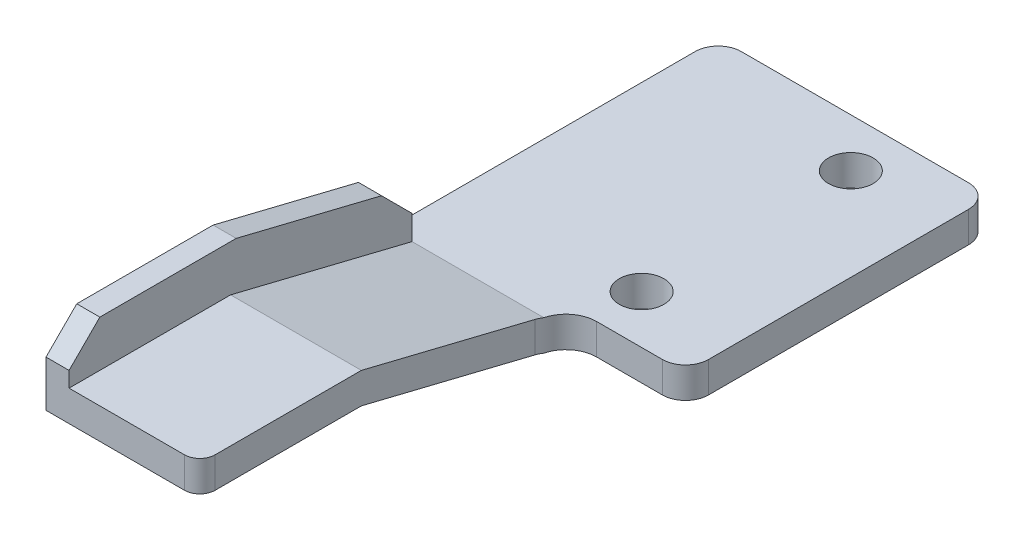
ISO-10303-21;
HEADER;
FILE_DESCRIPTION(('STEP AP214'),'2;1');
FILE_NAME('part.step','',(''),(''),'','','');
FILE_SCHEMA(('AUTOMOTIVE_DESIGN { 1 0 10303 214 1 1 1 1 }'));
ENDSEC;
DATA;
#1=APPLICATION_CONTEXT('core data for automotive mechanical design processes');
#2=APPLICATION_PROTOCOL_DEFINITION('international standard','automotive_design',2000,#1);
#3=PRODUCT_CONTEXT('',#1,'mechanical');
#4=PRODUCT('Part','Part','',(#3));
#5=PRODUCT_RELATED_PRODUCT_CATEGORY('part','',(#4));
#6=PRODUCT_DEFINITION_FORMATION('','',#4);
#7=PRODUCT_DEFINITION_CONTEXT('part definition',#1,'design');
#8=PRODUCT_DEFINITION('design','',#6,#7);
#9=PRODUCT_DEFINITION_SHAPE('','',#8);
#10=(LENGTH_UNIT() NAMED_UNIT(*) SI_UNIT(.MILLI.,.METRE.));
#11=(NAMED_UNIT(*) PLANE_ANGLE_UNIT() SI_UNIT($,.RADIAN.));
#12=(NAMED_UNIT(*) SI_UNIT($,.STERADIAN.) SOLID_ANGLE_UNIT());
#13=UNCERTAINTY_MEASURE_WITH_UNIT(LENGTH_MEASURE(1.E-05),#10,'distance_accuracy_value','');
#14=(GEOMETRIC_REPRESENTATION_CONTEXT(3) GLOBAL_UNCERTAINTY_ASSIGNED_CONTEXT((#13)) GLOBAL_UNIT_ASSIGNED_CONTEXT((#10,
#11,#12)) REPRESENTATION_CONTEXT('',''));
#15=CARTESIAN_POINT('',(0.,0.,0.));
#16=DIRECTION('',(0.,0.,1.));
#17=DIRECTION('',(1.,0.,0.));
#18=AXIS2_PLACEMENT_3D('',#15,#16,#17);
#19=CARTESIAN_POINT('',(1.115,2.,11.45));
#20=DIRECTION('',(0.,0.971102968422699,-0.238660899019138));
#21=DIRECTION('',(0.,0.238660899019138,0.971102968422699));
#22=AXIS2_PLACEMENT_3D('',#19,#20,#21);
#23=PLANE('',#22);
#24=DIRECTION('',(-1.,0.,0.));
#25=VECTOR('',#24,1.);
#26=CARTESIAN_POINT('',(1.115,2.,11.45));
#27=LINE('',#26,#25);
#28=CARTESIAN_POINT('',(1.17850832689629,2.,11.45));
#29=VERTEX_POINT('',#28);
#30=CARTESIAN_POINT('',(-7.385,2.,11.45));
#31=VERTEX_POINT('',#30);
#32=EDGE_CURVE('E66',#29,#31,#27,.T.);
#33=ORIENTED_EDGE('',*,*,#32,.T.);
#34=DIRECTION('',(0.,0.238660899019138,0.971102968422699));
#35=VECTOR('',#34,1.);
#36=CARTESIAN_POINT('',(-7.38499999999999,4.9,23.25));
#37=LINE('',#36,#35);
#38=CARTESIAN_POINT('',(-7.38499999999999,4.9,23.25));
#39=VERTEX_POINT('',#38);
#40=EDGE_CURVE('E229',#31,#39,#37,.T.);
#41=ORIENTED_EDGE('',*,*,#40,.T.);
#42=DIRECTION('',(-1.,0.,0.));
#43=VECTOR('',#42,1.);
#44=CARTESIAN_POINT('',(1.115,4.9,23.25));
#45=LINE('',#44,#43);
#46=CARTESIAN_POINT('',(1.115,4.9,23.25));
#47=VERTEX_POINT('',#46);
#48=EDGE_CURVE('E279',#47,#39,#45,.T.);
#49=ORIENTED_EDGE('',*,*,#48,.F.);
#50=DIRECTION('',(0.,-0.238660899019138,-0.971102968422699));
#51=VECTOR('',#50,1.);
#52=CARTESIAN_POINT('',(1.115,2.,11.45));
#53=LINE('',#52,#51);
#54=CARTESIAN_POINT('',(1.115,2.1228813559322,11.95));
#55=VERTEX_POINT('',#54);
#56=EDGE_CURVE('E263',#47,#55,#53,.T.);
#57=ORIENTED_EDGE('',*,*,#56,.T.);
#58=CARTESIAN_POINT('',(3.115,2.1228813559322,11.95));
#59=DIRECTION('',(0.,0.971102968422699,-0.238660899019138));
#60=DIRECTION('',(0.,0.238660899019138,0.971102968422699));
#61=AXIS2_PLACEMENT_3D('',#58,#59,#60);
#62=ELLIPSE('',#61,2.05951383636328,2.);
#63=EDGE_CURVE('E60',#55,#29,#62,.F.);
#64=ORIENTED_EDGE('',*,*,#63,.T.);
#65=EDGE_LOOP('',(#33,#41,#49,#57,#64));
#66=FACE_BOUND('',#65,.T.);
#67=ADVANCED_FACE('F51',(#66),#23,.T.);
#68=CARTESIAN_POINT('',(1.115,4.9,23.25));
#69=DIRECTION('',(0.,1.,0.));
#70=DIRECTION('',(0.,0.,1.));
#71=AXIS2_PLACEMENT_3D('',#68,#69,#70);
#72=PLANE('',#71);
#73=DIRECTION('',(-1.,0.,0.));
#74=VECTOR('',#73,1.);
#75=CARTESIAN_POINT('',(1.115,4.9,33.75));
#76=LINE('',#75,#74);
#77=CARTESIAN_POINT('',(0.115000000000002,4.9,33.75));
#78=VERTEX_POINT('',#77);
#79=CARTESIAN_POINT('',(-7.38499999999999,4.9,33.75));
#80=VERTEX_POINT('',#79);
#81=EDGE_CURVE('E283',#78,#80,#76,.T.);
#82=ORIENTED_EDGE('',*,*,#81,.F.);
#83=CARTESIAN_POINT('',(0.115000000000001,4.9,32.75));
#84=DIRECTION('',(0.,1.,0.));
#85=DIRECTION('',(0.,0.,1.));
#86=AXIS2_PLACEMENT_3D('',#83,#84,#85);
#87=CIRCLE('',#86,1.);
#88=CARTESIAN_POINT('',(1.115,4.9,32.75));
#89=VERTEX_POINT('',#88);
#90=EDGE_CURVE('E404',#78,#89,#87,.T.);
#91=ORIENTED_EDGE('',*,*,#90,.T.);
#92=DIRECTION('',(0.,0.,-1.));
#93=VECTOR('',#92,1.);
#94=CARTESIAN_POINT('',(1.115,4.9,23.25));
#95=LINE('',#94,#93);
#96=EDGE_CURVE('E260',#89,#47,#95,.T.);
#97=ORIENTED_EDGE('',*,*,#96,.T.);
#98=ORIENTED_EDGE('',*,*,#48,.T.);
#99=DIRECTION('',(0.,0.,1.));
#100=VECTOR('',#99,1.);
#101=CARTESIAN_POINT('',(-7.38499999999999,4.9,33.75));
#102=LINE('',#101,#100);
#103=EDGE_CURVE('E217',#39,#80,#102,.T.);
#104=ORIENTED_EDGE('',*,*,#103,.T.);
#105=EDGE_LOOP('',(#82,#91,#97,#98,#104));
#106=FACE_BOUND('',#105,.T.);
#107=ADVANCED_FACE('F475',(#106),#72,.T.);
#108=CARTESIAN_POINT('',(0.,2.,0.));
#109=DIRECTION('',(0.,-1.,0.));
#110=DIRECTION('',(0.,0.,-1.));
#111=AXIS2_PLACEMENT_3D('',#108,#109,#110);
#112=PLANE('',#111);
#113=ORIENTED_EDGE('',*,*,#32,.F.);
#114=CARTESIAN_POINT('',(3.115,2.,11.95));
#115=DIRECTION('',(0.,-1.,0.));
#116=DIRECTION('',(0.,0.,-1.));
#117=AXIS2_PLACEMENT_3D('',#114,#115,#116);
#118=CIRCLE('',#117,2.);
#119=CARTESIAN_POINT('',(3.115,2.,9.95));
#120=VERTEX_POINT('',#119);
#121=EDGE_CURVE('E11',#29,#120,#118,.T.);
#122=ORIENTED_EDGE('',*,*,#121,.T.);
#123=DIRECTION('',(1.,0.,0.));
#124=VECTOR('',#123,1.);
#125=CARTESIAN_POINT('',(8.885,2.,9.95));
#126=LINE('',#125,#124);
#127=CARTESIAN_POINT('',(7.385,2.,9.95));
#128=VERTEX_POINT('',#127);
#129=EDGE_CURVE('E312',#120,#128,#126,.T.);
#130=ORIENTED_EDGE('',*,*,#129,.T.);
#131=CARTESIAN_POINT('',(7.385,2.,8.45));
#132=DIRECTION('',(0.,-1.,0.));
#133=DIRECTION('',(0.,0.,-1.));
#134=AXIS2_PLACEMENT_3D('',#131,#132,#133);
#135=CIRCLE('',#134,1.5);
#136=CARTESIAN_POINT('',(8.885,2.,8.44999999999999));
#137=VERTEX_POINT('',#136);
#138=EDGE_CURVE('E386',#128,#137,#135,.F.);
#139=ORIENTED_EDGE('',*,*,#138,.T.);
#140=DIRECTION('',(0.,0.,-1.));
#141=VECTOR('',#140,1.);
#142=CARTESIAN_POINT('',(8.885,2.,-9.95));
#143=LINE('',#142,#141);
#144=CARTESIAN_POINT('',(8.885,2.,-8.45));
#145=VERTEX_POINT('',#144);
#146=EDGE_CURVE('E316',#137,#145,#143,.T.);
#147=ORIENTED_EDGE('',*,*,#146,.T.);
#148=CARTESIAN_POINT('',(7.385,2.,-8.45));
#149=DIRECTION('',(0.,-1.,0.));
#150=DIRECTION('',(0.,0.,-1.));
#151=AXIS2_PLACEMENT_3D('',#148,#149,#150);
#152=CIRCLE('',#151,1.5);
#153=CARTESIAN_POINT('',(7.385,2.,-9.95));
#154=VERTEX_POINT('',#153);
#155=EDGE_CURVE('E383',#145,#154,#152,.F.);
#156=ORIENTED_EDGE('',*,*,#155,.T.);
#157=DIRECTION('',(-1.,0.,0.));
#158=VECTOR('',#157,1.);
#159=CARTESIAN_POINT('',(8.885,2.,-9.95));
#160=LINE('',#159,#158);
#161=CARTESIAN_POINT('',(-7.385,2.,-9.95));
#162=VERTEX_POINT('',#161);
#163=EDGE_CURVE('E320',#154,#162,#160,.T.);
#164=ORIENTED_EDGE('',*,*,#163,.T.);
#165=CARTESIAN_POINT('',(-7.385,2.,-8.45));
#166=DIRECTION('',(0.,-1.,0.));
#167=DIRECTION('',(0.,0.,-1.));
#168=AXIS2_PLACEMENT_3D('',#165,#166,#167);
#169=CIRCLE('',#168,1.5);
#170=CARTESIAN_POINT('',(-8.885,2.,-8.45));
#171=VERTEX_POINT('',#170);
#172=EDGE_CURVE('E380',#162,#171,#169,.F.);
#173=ORIENTED_EDGE('',*,*,#172,.T.);
#174=DIRECTION('',(0.,0.,1.));
#175=VECTOR('',#174,1.);
#176=CARTESIAN_POINT('',(-8.885,2.,-9.95));
#177=LINE('',#176,#175);
#178=CARTESIAN_POINT('',(-8.885,2.,11.45));
#179=VERTEX_POINT('',#178);
#180=EDGE_CURVE('E309',#171,#179,#177,.T.);
#181=ORIENTED_EDGE('',*,*,#180,.T.);
#182=DIRECTION('',(-1.,0.,0.));
#183=VECTOR('',#182,1.);
#184=CARTESIAN_POINT('',(-7.385,2.,11.45));
#185=LINE('',#184,#183);
#186=EDGE_CURVE('E216',#31,#179,#185,.T.);
#187=ORIENTED_EDGE('',*,*,#186,.F.);
#188=EDGE_LOOP('',(#113,#122,#130,#139,#147,#156,#164,#173,#181,#187));
#189=FACE_BOUND('',#188,.T.);
#190=CARTESIAN_POINT('',(2.885,2.,-6.8));
#191=DIRECTION('',(0.,1.,0.));
#192=DIRECTION('',(0.,0.,1.));
#193=AXIS2_PLACEMENT_3D('',#190,#191,#192);
#194=CIRCLE('',#193,1.45);
#195=CARTESIAN_POINT('',(2.885,2.,-5.35));
#196=VERTEX_POINT('',#195);
#197=EDGE_CURVE('E302',#196,#196,#194,.T.);
#198=ORIENTED_EDGE('',*,*,#197,.F.);
#199=EDGE_LOOP('',(#198));
#200=FACE_BOUND('',#199,.T.);
#201=CARTESIAN_POINT('',(2.885,2.,6.8));
#202=DIRECTION('',(0.,1.,0.));
#203=DIRECTION('',(0.,0.,1.));
#204=AXIS2_PLACEMENT_3D('',#201,#202,#203);
#205=CIRCLE('',#204,1.45);
#206=CARTESIAN_POINT('',(2.885,2.,8.25));
#207=VERTEX_POINT('',#206);
#208=EDGE_CURVE('E294',#207,#207,#205,.T.);
#209=ORIENTED_EDGE('',*,*,#208,.F.);
#210=EDGE_LOOP('',(#209));
#211=FACE_BOUND('',#210,.T.);
#212=ADVANCED_FACE('F435',(#189,#200,#211),#112,.F.);
#213=CARTESIAN_POINT('',(0.,0.,0.));
#214=DIRECTION('',(0.,-1.,0.));
#215=DIRECTION('',(0.,0.,-1.));
#216=AXIS2_PLACEMENT_3D('',#213,#214,#215);
#217=PLANE('',#216);
#218=CARTESIAN_POINT('',(2.885,0.,-6.8));
#219=DIRECTION('',(0.,1.,0.));
#220=DIRECTION('',(0.,0.,1.));
#221=AXIS2_PLACEMENT_3D('',#218,#219,#220);
#222=CIRCLE('',#221,1.45);
#223=CARTESIAN_POINT('',(2.885,0.,-5.35));
#224=VERTEX_POINT('',#223);
#225=EDGE_CURVE('E298',#224,#224,#222,.T.);
#226=ORIENTED_EDGE('',*,*,#225,.T.);
#227=EDGE_LOOP('',(#226));
#228=FACE_BOUND('',#227,.T.);
#229=DIRECTION('',(0.,0.,-1.));
#230=VECTOR('',#229,1.);
#231=CARTESIAN_POINT('',(8.885,0.,-9.95));
#232=LINE('',#231,#230);
#233=CARTESIAN_POINT('',(8.885,0.,8.44999999999999));
#234=VERTEX_POINT('',#233);
#235=CARTESIAN_POINT('',(8.885,0.,-8.45));
#236=VERTEX_POINT('',#235);
#237=EDGE_CURVE('E330',#234,#236,#232,.T.);
#238=ORIENTED_EDGE('',*,*,#237,.F.);
#239=CARTESIAN_POINT('',(7.385,0.,8.45));
#240=DIRECTION('',(0.,-1.,0.));
#241=DIRECTION('',(0.,0.,-1.));
#242=AXIS2_PLACEMENT_3D('',#239,#240,#241);
#243=CIRCLE('',#242,1.5);
#244=CARTESIAN_POINT('',(7.385,0.,9.95));
#245=VERTEX_POINT('',#244);
#246=EDGE_CURVE('E372',#234,#245,#243,.T.);
#247=ORIENTED_EDGE('',*,*,#246,.T.);
#248=DIRECTION('',(1.,0.,0.));
#249=VECTOR('',#248,1.);
#250=CARTESIAN_POINT('',(8.885,0.,9.95));
#251=LINE('',#250,#249);
#252=CARTESIAN_POINT('',(3.115,0.,9.95));
#253=VERTEX_POINT('',#252);
#254=EDGE_CURVE('E327',#253,#245,#251,.T.);
#255=ORIENTED_EDGE('',*,*,#254,.F.);
#256=CARTESIAN_POINT('',(3.115,0.,11.95));
#257=DIRECTION('',(0.,-1.,0.));
#258=DIRECTION('',(0.,0.,-1.));
#259=AXIS2_PLACEMENT_3D('',#256,#257,#258);
#260=CIRCLE('',#259,2.);
#261=CARTESIAN_POINT('',(1.17850832689629,0.,11.45));
#262=VERTEX_POINT('',#261);
#263=EDGE_CURVE('E420',#253,#262,#260,.F.);
#264=ORIENTED_EDGE('',*,*,#263,.T.);
#265=DIRECTION('',(-1.,0.,0.));
#266=VECTOR('',#265,1.);
#267=CARTESIAN_POINT('',(1.115,0.,11.45));
#268=LINE('',#267,#266);
#269=CARTESIAN_POINT('',(-8.885,0.,11.45));
#270=VERTEX_POINT('',#269);
#271=EDGE_CURVE('E74',#262,#270,#268,.T.);
#272=ORIENTED_EDGE('',*,*,#271,.T.);
#273=DIRECTION('',(0.,0.,1.));
#274=VECTOR('',#273,1.);
#275=CARTESIAN_POINT('',(-8.885,0.,-9.95));
#276=LINE('',#275,#274);
#277=CARTESIAN_POINT('',(-8.885,0.,-8.45));
#278=VERTEX_POINT('',#277);
#279=EDGE_CURVE('E305',#278,#270,#276,.T.);
#280=ORIENTED_EDGE('',*,*,#279,.F.);
#281=CARTESIAN_POINT('',(-7.385,0.,-8.45));
#282=DIRECTION('',(0.,-1.,0.));
#283=DIRECTION('',(0.,0.,-1.));
#284=AXIS2_PLACEMENT_3D('',#281,#282,#283);
#285=CIRCLE('',#284,1.5);
#286=CARTESIAN_POINT('',(-7.385,0.,-9.95));
#287=VERTEX_POINT('',#286);
#288=EDGE_CURVE('E366',#278,#287,#285,.T.);
#289=ORIENTED_EDGE('',*,*,#288,.T.);
#290=DIRECTION('',(-1.,0.,0.));
#291=VECTOR('',#290,1.);
#292=CARTESIAN_POINT('',(8.885,0.,-9.95));
#293=LINE('',#292,#291);
#294=CARTESIAN_POINT('',(7.385,0.,-9.95));
#295=VERTEX_POINT('',#294);
#296=EDGE_CURVE('E313',#295,#287,#293,.T.);
#297=ORIENTED_EDGE('',*,*,#296,.F.);
#298=CARTESIAN_POINT('',(7.385,0.,-8.45));
#299=DIRECTION('',(0.,-1.,0.));
#300=DIRECTION('',(0.,0.,-1.));
#301=AXIS2_PLACEMENT_3D('',#298,#299,#300);
#302=CIRCLE('',#301,1.5);
#303=EDGE_CURVE('E369',#295,#236,#302,.T.);
#304=ORIENTED_EDGE('',*,*,#303,.T.);
#305=EDGE_LOOP('',(#238,#247,#255,#264,#272,#280,#289,#297,#304));
#306=FACE_BOUND('',#305,.T.);
#307=CARTESIAN_POINT('',(2.885,0.,6.8));
#308=DIRECTION('',(0.,1.,0.));
#309=DIRECTION('',(0.,0.,1.));
#310=AXIS2_PLACEMENT_3D('',#307,#308,#309);
#311=CIRCLE('',#310,1.45);
#312=CARTESIAN_POINT('',(2.885,0.,8.25));
#313=VERTEX_POINT('',#312);
#314=EDGE_CURVE('E278',#313,#313,#311,.T.);
#315=ORIENTED_EDGE('',*,*,#314,.T.);
#316=EDGE_LOOP('',(#315));
#317=FACE_BOUND('',#316,.T.);
#318=ADVANCED_FACE('F527',(#228,#306,#317),#217,.T.);
#319=CARTESIAN_POINT('',(-8.885,2.,-9.95));
#320=DIRECTION('',(1.,0.,0.));
#321=DIRECTION('',(0.,0.,-1.));
#322=AXIS2_PLACEMENT_3D('',#319,#320,#321);
#323=PLANE('',#322);
#324=ORIENTED_EDGE('',*,*,#180,.F.);
#325=DIRECTION('',(0.,-1.,0.));
#326=VECTOR('',#325,1.);
#327=CARTESIAN_POINT('',(-8.885,2.,-8.45));
#328=LINE('',#327,#326);
#329=EDGE_CURVE('E396',#171,#278,#328,.T.);
#330=ORIENTED_EDGE('',*,*,#329,.T.);
#331=ORIENTED_EDGE('',*,*,#279,.T.);
#332=DIRECTION('',(0.,0.238660899019138,0.971102968422699));
#333=VECTOR('',#332,1.);
#334=CARTESIAN_POINT('',(-8.885,0.,11.45));
#335=LINE('',#334,#333);
#336=CARTESIAN_POINT('',(-8.885,2.9,23.25));
#337=VERTEX_POINT('',#336);
#338=EDGE_CURVE('E250',#270,#337,#335,.T.);
#339=ORIENTED_EDGE('',*,*,#338,.T.);
#340=DIRECTION('',(0.,0.,1.));
#341=VECTOR('',#340,1.);
#342=CARTESIAN_POINT('',(-8.885,2.9,23.25));
#343=LINE('',#342,#341);
#344=CARTESIAN_POINT('',(-8.88499999999999,2.9,33.75));
#345=VERTEX_POINT('',#344);
#346=EDGE_CURVE('E270',#337,#345,#343,.T.);
#347=ORIENTED_EDGE('',*,*,#346,.T.);
#348=DIRECTION('',(0.,1.,0.));
#349=VECTOR('',#348,1.);
#350=CARTESIAN_POINT('',(-8.88499999999999,2.9,33.75));
#351=LINE('',#350,#349);
#352=CARTESIAN_POINT('',(-8.88499999999999,5.89999999999999,33.75));
#353=VERTEX_POINT('',#352);
#354=EDGE_CURVE('E256',#345,#353,#351,.T.);
#355=ORIENTED_EDGE('',*,*,#354,.T.);
#356=DIRECTION('',(0.,-0.707106781186546,0.707106781186549));
#357=VECTOR('',#356,1.);
#358=CARTESIAN_POINT('',(-8.885,5.89999999999999,33.75));
#359=LINE('',#358,#357);
#360=CARTESIAN_POINT('',(-8.88499999999999,7.9,31.75));
#361=VERTEX_POINT('',#360);
#362=EDGE_CURVE('E340',#353,#361,#359,.F.);
#363=ORIENTED_EDGE('',*,*,#362,.T.);
#364=DIRECTION('',(0.,0.,-1.));
#365=VECTOR('',#364,1.);
#366=CARTESIAN_POINT('',(-8.88499999999999,7.9,33.75));
#367=LINE('',#366,#365);
#368=CARTESIAN_POINT('',(-8.88499999999999,7.9,22.8867603780586));
#369=VERTEX_POINT('',#368);
#370=EDGE_CURVE('E239',#361,#369,#367,.T.);
#371=ORIENTED_EDGE('',*,*,#370,.T.);
#372=DIRECTION('',(0.,-0.238660899019138,-0.971102968422699));
#373=VECTOR('',#372,1.);
#374=CARTESIAN_POINT('',(-8.88499999999999,7.9,22.8867603780586));
#375=LINE('',#374,#373);
#376=CARTESIAN_POINT('',(-8.885,5.57803479948874,13.4387640449438));
#377=VERTEX_POINT('',#376);
#378=EDGE_CURVE('E214',#369,#377,#375,.T.);
#379=ORIENTED_EDGE('',*,*,#378,.T.);
#380=DIRECTION('',(0.,0.707106781186547,0.707106781186548));
#381=VECTOR('',#380,1.);
#382=CARTESIAN_POINT('',(-8.885,5.57803479948874,13.4387640449438));
#383=LINE('',#382,#381);
#384=CARTESIAN_POINT('',(-8.885,3.58927075454492,11.45));
#385=VERTEX_POINT('',#384);
#386=EDGE_CURVE('E351',#377,#385,#383,.F.);
#387=ORIENTED_EDGE('',*,*,#386,.T.);
#388=DIRECTION('',(0.,-1.,0.));
#389=VECTOR('',#388,1.);
#390=CARTESIAN_POINT('',(-8.885,5.08927075454492,11.45));
#391=LINE('',#390,#389);
#392=EDGE_CURVE('E244',#385,#179,#391,.T.);
#393=ORIENTED_EDGE('',*,*,#392,.T.);
#394=EDGE_LOOP('',(#324,#330,#331,#339,#347,#355,#363,#371,#379,#387,#393));
#395=FACE_BOUND('',#394,.T.);
#396=ADVANCED_FACE('F465',(#395),#323,.F.);
#397=CARTESIAN_POINT('',(8.885,2.,9.95));
#398=DIRECTION('',(0.,0.,-1.));
#399=DIRECTION('',(-1.,0.,0.));
#400=AXIS2_PLACEMENT_3D('',#397,#398,#399);
#401=PLANE('',#400);
#402=ORIENTED_EDGE('',*,*,#129,.F.);
#403=DIRECTION('',(0.,-1.,0.));
#404=VECTOR('',#403,1.);
#405=CARTESIAN_POINT('',(3.115,0.,9.95));
#406=LINE('',#405,#404);
#407=EDGE_CURVE('E413',#120,#253,#406,.T.);
#408=ORIENTED_EDGE('',*,*,#407,.T.);
#409=ORIENTED_EDGE('',*,*,#254,.T.);
#410=DIRECTION('',(0.,-1.,0.));
#411=VECTOR('',#410,1.);
#412=CARTESIAN_POINT('',(7.385,2.,9.95));
#413=LINE('',#412,#411);
#414=EDGE_CURVE('E376',#245,#128,#413,.F.);
#415=ORIENTED_EDGE('',*,*,#414,.T.);
#416=EDGE_LOOP('',(#402,#408,#409,#415));
#417=FACE_BOUND('',#416,.T.);
#418=ADVANCED_FACE('F438',(#417),#401,.F.);
#419=CARTESIAN_POINT('',(8.885,2.,-9.95));
#420=DIRECTION('',(-1.,0.,0.));
#421=DIRECTION('',(0.,0.,1.));
#422=AXIS2_PLACEMENT_3D('',#419,#420,#421);
#423=PLANE('',#422);
#424=ORIENTED_EDGE('',*,*,#146,.F.);
#425=DIRECTION('',(0.,-1.,0.));
#426=VECTOR('',#425,1.);
#427=CARTESIAN_POINT('',(8.885,2.,8.45));
#428=LINE('',#427,#426);
#429=EDGE_CURVE('E362',#137,#234,#428,.T.);
#430=ORIENTED_EDGE('',*,*,#429,.T.);
#431=ORIENTED_EDGE('',*,*,#237,.T.);
#432=DIRECTION('',(0.,-1.,0.));
#433=VECTOR('',#432,1.);
#434=CARTESIAN_POINT('',(8.885,2.,-8.45));
#435=LINE('',#434,#433);
#436=EDGE_CURVE('E359',#236,#145,#435,.F.);
#437=ORIENTED_EDGE('',*,*,#436,.T.);
#438=EDGE_LOOP('',(#424,#430,#431,#437));
#439=FACE_BOUND('',#438,.T.);
#440=ADVANCED_FACE('F448',(#439),#423,.F.);
#441=CARTESIAN_POINT('',(8.885,2.,-9.95));
#442=DIRECTION('',(0.,0.,1.));
#443=DIRECTION('',(1.,0.,0.));
#444=AXIS2_PLACEMENT_3D('',#441,#442,#443);
#445=PLANE('',#444);
#446=ORIENTED_EDGE('',*,*,#163,.F.);
#447=DIRECTION('',(0.,-1.,0.));
#448=VECTOR('',#447,1.);
#449=CARTESIAN_POINT('',(7.385,2.,-9.95));
#450=LINE('',#449,#448);
#451=EDGE_CURVE('E392',#154,#295,#450,.T.);
#452=ORIENTED_EDGE('',*,*,#451,.T.);
#453=ORIENTED_EDGE('',*,*,#296,.T.);
#454=DIRECTION('',(0.,-1.,0.));
#455=VECTOR('',#454,1.);
#456=CARTESIAN_POINT('',(-7.385,2.,-9.95));
#457=LINE('',#456,#455);
#458=EDGE_CURVE('E389',#287,#162,#457,.F.);
#459=ORIENTED_EDGE('',*,*,#458,.T.);
#460=EDGE_LOOP('',(#446,#452,#453,#459));
#461=FACE_BOUND('',#460,.T.);
#462=ADVANCED_FACE('F457',(#461),#445,.F.);
#463=CARTESIAN_POINT('',(2.885,2.,-6.8));
#464=DIRECTION('',(0.,-1.,0.));
#465=DIRECTION('',(0.,0.,-1.));
#466=AXIS2_PLACEMENT_3D('',#463,#464,#465);
#467=CYLINDRICAL_SURFACE('',#466,1.45);
#468=ORIENTED_EDGE('',*,*,#197,.T.);
#469=EDGE_LOOP('',(#468));
#470=FACE_BOUND('',#469,.T.);
#471=ORIENTED_EDGE('',*,*,#225,.F.);
#472=EDGE_LOOP('',(#471));
#473=FACE_BOUND('',#472,.T.);
#474=ADVANCED_FACE('F517',(#470,#473),#467,.F.);
#475=CARTESIAN_POINT('',(2.885,2.,6.8));
#476=DIRECTION('',(0.,-1.,0.));
#477=DIRECTION('',(0.,0.,-1.));
#478=AXIS2_PLACEMENT_3D('',#475,#476,#477);
#479=CYLINDRICAL_SURFACE('',#478,1.45);
#480=ORIENTED_EDGE('',*,*,#208,.T.);
#481=EDGE_LOOP('',(#480));
#482=FACE_BOUND('',#481,.T.);
#483=ORIENTED_EDGE('',*,*,#314,.F.);
#484=EDGE_LOOP('',(#483));
#485=FACE_BOUND('',#484,.T.);
#486=ADVANCED_FACE('F514',(#482,#485),#479,.F.);
#487=CARTESIAN_POINT('',(1.115,2.9,33.75));
#488=DIRECTION('',(0.,0.,1.));
#489=DIRECTION('',(1.,0.,0.));
#490=AXIS2_PLACEMENT_3D('',#487,#488,#489);
#491=PLANE('',#490);
#492=DIRECTION('',(-1.,0.,0.));
#493=VECTOR('',#492,1.);
#494=CARTESIAN_POINT('',(1.115,2.9,33.75));
#495=LINE('',#494,#493);
#496=CARTESIAN_POINT('',(0.115000000000002,2.9,33.75));
#497=VERTEX_POINT('',#496);
#498=EDGE_CURVE('E286',#497,#345,#495,.T.);
#499=ORIENTED_EDGE('',*,*,#498,.F.);
#500=DIRECTION('',(0.,1.,0.));
#501=VECTOR('',#500,1.);
#502=CARTESIAN_POINT('',(0.115000000000002,4.9,33.75));
#503=LINE('',#502,#501);
#504=EDGE_CURVE('E400',#497,#78,#503,.T.);
#505=ORIENTED_EDGE('',*,*,#504,.T.);
#506=ORIENTED_EDGE('',*,*,#81,.T.);
#507=DIRECTION('',(0.,1.,0.));
#508=VECTOR('',#507,1.);
#509=CARTESIAN_POINT('',(-7.38499999999999,4.9,33.75));
#510=LINE('',#509,#508);
#511=CARTESIAN_POINT('',(-7.38499999999999,5.89999999999999,33.75));
#512=VERTEX_POINT('',#511);
#513=EDGE_CURVE('E206',#80,#512,#510,.T.);
#514=ORIENTED_EDGE('',*,*,#513,.T.);
#515=DIRECTION('',(-1.,0.,0.));
#516=VECTOR('',#515,1.);
#517=CARTESIAN_POINT('',(1.115,5.89999999999999,33.75));
#518=LINE('',#517,#516);
#519=EDGE_CURVE('E324',#512,#353,#518,.T.);
#520=ORIENTED_EDGE('',*,*,#519,.T.);
#521=ORIENTED_EDGE('',*,*,#354,.F.);
#522=EDGE_LOOP('',(#499,#505,#506,#514,#520,#521));
#523=FACE_BOUND('',#522,.T.);
#524=ADVANCED_FACE('F493',(#523),#491,.T.);
#525=CARTESIAN_POINT('',(1.115,2.9,23.25));
#526=DIRECTION('',(0.,-1.,0.));
#527=DIRECTION('',(0.,0.,-1.));
#528=AXIS2_PLACEMENT_3D('',#525,#526,#527);
#529=PLANE('',#528);
#530=DIRECTION('',(0.,0.,1.));
#531=VECTOR('',#530,1.);
#532=CARTESIAN_POINT('',(1.115,2.9,23.25));
#533=LINE('',#532,#531);
#534=CARTESIAN_POINT('',(1.115,2.9,23.25));
#535=VERTEX_POINT('',#534);
#536=CARTESIAN_POINT('',(1.115,2.9,32.75));
#537=VERTEX_POINT('',#536);
#538=EDGE_CURVE('E255',#535,#537,#533,.T.);
#539=ORIENTED_EDGE('',*,*,#538,.T.);
#540=CARTESIAN_POINT('',(0.115000000000001,2.9,32.75));
#541=DIRECTION('',(0.,-1.,0.));
#542=DIRECTION('',(0.,0.,-1.));
#543=AXIS2_PLACEMENT_3D('',#540,#541,#542);
#544=CIRCLE('',#543,1.);
#545=EDGE_CURVE('E410',#537,#497,#544,.T.);
#546=ORIENTED_EDGE('',*,*,#545,.T.);
#547=ORIENTED_EDGE('',*,*,#498,.T.);
#548=ORIENTED_EDGE('',*,*,#346,.F.);
#549=DIRECTION('',(-1.,0.,0.));
#550=VECTOR('',#549,1.);
#551=CARTESIAN_POINT('',(1.115,2.9,23.25));
#552=LINE('',#551,#550);
#553=EDGE_CURVE('E289',#535,#337,#552,.T.);
#554=ORIENTED_EDGE('',*,*,#553,.F.);
#555=EDGE_LOOP('',(#539,#546,#547,#548,#554));
#556=FACE_BOUND('',#555,.T.);
#557=ADVANCED_FACE('F488',(#556),#529,.T.);
#558=CARTESIAN_POINT('',(1.115,0.,11.45));
#559=DIRECTION('',(0.,-0.971102968422699,0.238660899019138));
#560=DIRECTION('',(0.,-0.238660899019138,-0.971102968422699));
#561=AXIS2_PLACEMENT_3D('',#558,#559,#560);
#562=PLANE('',#561);
#563=ORIENTED_EDGE('',*,*,#338,.F.);
#564=ORIENTED_EDGE('',*,*,#271,.F.);
#565=CARTESIAN_POINT('',(3.115,0.122881355932204,11.95));
#566=DIRECTION('',(0.,-0.971102968422699,0.238660899019138));
#567=DIRECTION('',(0.,0.238660899019138,0.971102968422699));
#568=AXIS2_PLACEMENT_3D('',#565,#566,#567);
#569=ELLIPSE('',#568,2.05951383636328,2.);
#570=CARTESIAN_POINT('',(1.115,0.122881355932204,11.95));
#571=VERTEX_POINT('',#570);
#572=EDGE_CURVE('E423',#262,#571,#569,.F.);
#573=ORIENTED_EDGE('',*,*,#572,.T.);
#574=DIRECTION('',(0.,0.238660899019138,0.971102968422699));
#575=VECTOR('',#574,1.);
#576=CARTESIAN_POINT('',(1.115,0.,11.45));
#577=LINE('',#576,#575);
#578=EDGE_CURVE('E252',#571,#535,#577,.T.);
#579=ORIENTED_EDGE('',*,*,#578,.T.);
#580=ORIENTED_EDGE('',*,*,#553,.T.);
#581=EDGE_LOOP('',(#563,#564,#573,#579,#580));
#582=FACE_BOUND('',#581,.T.);
#583=ADVANCED_FACE('F497',(#582),#562,.T.);
#584=CARTESIAN_POINT('',(1.115,0.,0.));
#585=DIRECTION('',(-1.,0.,0.));
#586=DIRECTION('',(0.,0.,1.));
#587=AXIS2_PLACEMENT_3D('',#584,#585,#586);
#588=PLANE('',#587);
#589=ORIENTED_EDGE('',*,*,#578,.F.);
#590=DIRECTION('',(0.,-1.,0.));
#591=VECTOR('',#590,1.);
#592=CARTESIAN_POINT('',(1.115,2.,11.95));
#593=LINE('',#592,#591);
#594=EDGE_CURVE('E417',#571,#55,#593,.F.);
#595=ORIENTED_EDGE('',*,*,#594,.T.);
#596=ORIENTED_EDGE('',*,*,#56,.F.);
#597=ORIENTED_EDGE('',*,*,#96,.F.);
#598=DIRECTION('',(0.,1.,0.));
#599=VECTOR('',#598,1.);
#600=CARTESIAN_POINT('',(1.115,2.9,32.75));
#601=LINE('',#600,#599);
#602=EDGE_CURVE('E407',#89,#537,#601,.F.);
#603=ORIENTED_EDGE('',*,*,#602,.T.);
#604=ORIENTED_EDGE('',*,*,#538,.F.);
#605=EDGE_LOOP('',(#589,#595,#596,#597,#603,#604));
#606=FACE_BOUND('',#605,.T.);
#607=ADVANCED_FACE('F480',(#606),#588,.F.);
#608=CARTESIAN_POINT('',(-7.385,5.08927075454492,11.45));
#609=DIRECTION('',(0.,0.,-1.));
#610=DIRECTION('',(-1.,0.,0.));
#611=AXIS2_PLACEMENT_3D('',#608,#609,#610);
#612=PLANE('',#611);
#613=ORIENTED_EDGE('',*,*,#392,.F.);
#614=DIRECTION('',(1.,0.,0.));
#615=VECTOR('',#614,1.);
#616=CARTESIAN_POINT('',(-7.385,3.58927075454492,11.45));
#617=LINE('',#616,#615);
#618=CARTESIAN_POINT('',(-7.385,3.58927075454492,11.45));
#619=VERTEX_POINT('',#618);
#620=EDGE_CURVE('E354',#385,#619,#617,.T.);
#621=ORIENTED_EDGE('',*,*,#620,.T.);
#622=DIRECTION('',(0.,-1.,0.));
#623=VECTOR('',#622,1.);
#624=CARTESIAN_POINT('',(-7.385,5.08927075454492,11.45));
#625=LINE('',#624,#623);
#626=EDGE_CURVE('E224',#619,#31,#625,.T.);
#627=ORIENTED_EDGE('',*,*,#626,.T.);
#628=ORIENTED_EDGE('',*,*,#186,.T.);
#629=EDGE_LOOP('',(#613,#621,#627,#628));
#630=FACE_BOUND('',#629,.T.);
#631=ADVANCED_FACE('F470',(#630),#612,.T.);
#632=CARTESIAN_POINT('',(-7.385,7.9,22.8867603780586));
#633=DIRECTION('',(0.,0.971102968422699,-0.238660899019138));
#634=DIRECTION('',(0.,0.238660899019138,0.971102968422699));
#635=AXIS2_PLACEMENT_3D('',#632,#633,#634);
#636=PLANE('',#635);
#637=DIRECTION('',(0.,-0.238660899019138,-0.971102968422699));
#638=VECTOR('',#637,1.);
#639=CARTESIAN_POINT('',(-7.385,7.9,22.8867603780586));
#640=LINE('',#639,#638);
#641=CARTESIAN_POINT('',(-7.385,7.9,22.8867603780586));
#642=VERTEX_POINT('',#641);
#643=CARTESIAN_POINT('',(-7.385,5.57803479948874,13.4387640449438));
#644=VERTEX_POINT('',#643);
#645=EDGE_CURVE('E205',#642,#644,#640,.T.);
#646=ORIENTED_EDGE('',*,*,#645,.T.);
#647=DIRECTION('',(-1.,0.,0.));
#648=VECTOR('',#647,1.);
#649=CARTESIAN_POINT('',(-7.385,5.57803479948874,13.4387640449438));
#650=LINE('',#649,#648);
#651=EDGE_CURVE('E348',#644,#377,#650,.T.);
#652=ORIENTED_EDGE('',*,*,#651,.T.);
#653=ORIENTED_EDGE('',*,*,#378,.F.);
#654=DIRECTION('',(-1.,0.,0.));
#655=VECTOR('',#654,1.);
#656=CARTESIAN_POINT('',(-7.385,7.9,22.8867603780586));
#657=LINE('',#656,#655);
#658=EDGE_CURVE('E197',#642,#369,#657,.T.);
#659=ORIENTED_EDGE('',*,*,#658,.F.);
#660=EDGE_LOOP('',(#646,#652,#653,#659));
#661=FACE_BOUND('',#660,.T.);
#662=ADVANCED_FACE('F210',(#661),#636,.T.);
#663=CARTESIAN_POINT('',(-7.38499999999999,7.9,33.75));
#664=DIRECTION('',(0.,1.,0.));
#665=DIRECTION('',(0.,0.,1.));
#666=AXIS2_PLACEMENT_3D('',#663,#664,#665);
#667=PLANE('',#666);
#668=ORIENTED_EDGE('',*,*,#370,.F.);
#669=DIRECTION('',(1.,0.,0.));
#670=VECTOR('',#669,1.);
#671=CARTESIAN_POINT('',(-7.38499999999999,7.9,31.75));
#672=LINE('',#671,#670);
#673=CARTESIAN_POINT('',(-7.38499999999999,7.9,31.75));
#674=VERTEX_POINT('',#673);
#675=EDGE_CURVE('E200',#361,#674,#672,.T.);
#676=ORIENTED_EDGE('',*,*,#675,.T.);
#677=DIRECTION('',(0.,0.,-1.));
#678=VECTOR('',#677,1.);
#679=CARTESIAN_POINT('',(-7.38499999999999,7.9,33.75));
#680=LINE('',#679,#678);
#681=EDGE_CURVE('E193',#674,#642,#680,.T.);
#682=ORIENTED_EDGE('',*,*,#681,.T.);
#683=ORIENTED_EDGE('',*,*,#658,.T.);
#684=EDGE_LOOP('',(#668,#676,#682,#683));
#685=FACE_BOUND('',#684,.T.);
#686=ADVANCED_FACE('F196',(#685),#667,.T.);
#687=CARTESIAN_POINT('',(-7.385,0.,0.));
#688=DIRECTION('',(-1.,0.,0.));
#689=DIRECTION('',(0.,0.,1.));
#690=AXIS2_PLACEMENT_3D('',#687,#688,#689);
#691=PLANE('',#690);
#692=ORIENTED_EDGE('',*,*,#626,.F.);
#693=DIRECTION('',(0.,-0.707106781186547,-0.707106781186548));
#694=VECTOR('',#693,1.);
#695=CARTESIAN_POINT('',(-7.385,5.57803479948874,13.4387640449438));
#696=LINE('',#695,#694);
#697=EDGE_CURVE('E222',#619,#644,#696,.F.);
#698=ORIENTED_EDGE('',*,*,#697,.T.);
#699=ORIENTED_EDGE('',*,*,#645,.F.);
#700=ORIENTED_EDGE('',*,*,#681,.F.);
#701=DIRECTION('',(0.,0.707106781186546,-0.707106781186549));
#702=VECTOR('',#701,1.);
#703=CARTESIAN_POINT('',(-7.38499999999999,5.89999999999999,33.75));
#704=LINE('',#703,#702);
#705=EDGE_CURVE('E345',#674,#512,#704,.F.);
#706=ORIENTED_EDGE('',*,*,#705,.T.);
#707=ORIENTED_EDGE('',*,*,#513,.F.);
#708=ORIENTED_EDGE('',*,*,#103,.F.);
#709=ORIENTED_EDGE('',*,*,#40,.F.);
#710=EDGE_LOOP('',(#692,#698,#699,#700,#706,#707,#708,#709));
#711=FACE_BOUND('',#710,.T.);
#712=ADVANCED_FACE('F220',(#711),#691,.F.);
#713=CARTESIAN_POINT('',(1.115,5.89999999999999,33.75));
#714=DIRECTION('',(0.,-0.707106781186549,-0.707106781186546));
#715=DIRECTION('',(-1.,0.,0.));
#716=AXIS2_PLACEMENT_3D('',#713,#714,#715);
#717=PLANE('',#716);
#718=ORIENTED_EDGE('',*,*,#705,.F.);
#719=ORIENTED_EDGE('',*,*,#675,.F.);
#720=ORIENTED_EDGE('',*,*,#362,.F.);
#721=ORIENTED_EDGE('',*,*,#519,.F.);
#722=EDGE_LOOP('',(#718,#719,#720,#721));
#723=FACE_BOUND('',#722,.T.);
#724=ADVANCED_FACE('F540',(#723),#717,.F.);
#725=CARTESIAN_POINT('',(-7.385,5.57803479948874,13.4387640449438));
#726=DIRECTION('',(0.,-0.707106781186548,0.707106781186547));
#727=DIRECTION('',(-1.,0.,0.));
#728=AXIS2_PLACEMENT_3D('',#725,#726,#727);
#729=PLANE('',#728);
#730=ORIENTED_EDGE('',*,*,#697,.F.);
#731=ORIENTED_EDGE('',*,*,#620,.F.);
#732=ORIENTED_EDGE('',*,*,#386,.F.);
#733=ORIENTED_EDGE('',*,*,#651,.F.);
#734=EDGE_LOOP('',(#730,#731,#732,#733));
#735=FACE_BOUND('',#734,.T.);
#736=ADVANCED_FACE('F546',(#735),#729,.F.);
#737=CARTESIAN_POINT('',(7.385,2.,8.45));
#738=DIRECTION('',(0.,-1.,0.));
#739=DIRECTION('',(0.,0.,-1.));
#740=AXIS2_PLACEMENT_3D('',#737,#738,#739);
#741=CYLINDRICAL_SURFACE('',#740,1.5);
#742=ORIENTED_EDGE('',*,*,#138,.F.);
#743=ORIENTED_EDGE('',*,*,#414,.F.);
#744=ORIENTED_EDGE('',*,*,#246,.F.);
#745=ORIENTED_EDGE('',*,*,#429,.F.);
#746=EDGE_LOOP('',(#742,#743,#744,#745));
#747=FACE_BOUND('',#746,.T.);
#748=ADVANCED_FACE('F444',(#747),#741,.T.);
#749=CARTESIAN_POINT('',(7.385,2.,-8.45));
#750=DIRECTION('',(0.,-1.,0.));
#751=DIRECTION('',(0.,0.,-1.));
#752=AXIS2_PLACEMENT_3D('',#749,#750,#751);
#753=CYLINDRICAL_SURFACE('',#752,1.5);
#754=ORIENTED_EDGE('',*,*,#155,.F.);
#755=ORIENTED_EDGE('',*,*,#436,.F.);
#756=ORIENTED_EDGE('',*,*,#303,.F.);
#757=ORIENTED_EDGE('',*,*,#451,.F.);
#758=EDGE_LOOP('',(#754,#755,#756,#757));
#759=FACE_BOUND('',#758,.T.);
#760=ADVANCED_FACE('F452',(#759),#753,.T.);
#761=CARTESIAN_POINT('',(-7.385,2.,-8.45));
#762=DIRECTION('',(0.,-1.,0.));
#763=DIRECTION('',(0.,0.,-1.));
#764=AXIS2_PLACEMENT_3D('',#761,#762,#763);
#765=CYLINDRICAL_SURFACE('',#764,1.5);
#766=ORIENTED_EDGE('',*,*,#172,.F.);
#767=ORIENTED_EDGE('',*,*,#458,.F.);
#768=ORIENTED_EDGE('',*,*,#288,.F.);
#769=ORIENTED_EDGE('',*,*,#329,.F.);
#770=EDGE_LOOP('',(#766,#767,#768,#769));
#771=FACE_BOUND('',#770,.T.);
#772=ADVANCED_FACE('F461',(#771),#765,.T.);
#773=CARTESIAN_POINT('',(0.115000000000001,2.9,32.75));
#774=DIRECTION('',(0.,-1.,0.));
#775=DIRECTION('',(0.,0.,-1.));
#776=AXIS2_PLACEMENT_3D('',#773,#774,#775);
#777=CYLINDRICAL_SURFACE('',#776,1.);
#778=ORIENTED_EDGE('',*,*,#545,.F.);
#779=ORIENTED_EDGE('',*,*,#602,.F.);
#780=ORIENTED_EDGE('',*,*,#90,.F.);
#781=ORIENTED_EDGE('',*,*,#504,.F.);
#782=EDGE_LOOP('',(#778,#779,#780,#781));
#783=FACE_BOUND('',#782,.T.);
#784=ADVANCED_FACE('F484',(#783),#777,.T.);
#785=CARTESIAN_POINT('',(3.115,2.,11.95));
#786=DIRECTION('',(0.,1.,0.));
#787=DIRECTION('',(0.,0.,1.));
#788=AXIS2_PLACEMENT_3D('',#785,#786,#787);
#789=CYLINDRICAL_SURFACE('',#788,2.);
#790=ORIENTED_EDGE('',*,*,#63,.F.);
#791=ORIENTED_EDGE('',*,*,#594,.F.);
#792=ORIENTED_EDGE('',*,*,#572,.F.);
#793=ORIENTED_EDGE('',*,*,#263,.F.);
#794=ORIENTED_EDGE('',*,*,#407,.F.);
#795=ORIENTED_EDGE('',*,*,#121,.F.);
#796=EDGE_LOOP('',(#790,#791,#792,#793,#794,#795));
#797=FACE_BOUND('',#796,.T.);
#798=ADVANCED_FACE('F53',(#797),#789,.F.);
#799=CLOSED_SHELL('',(#67,#107,#212,#318,#396,#418,#440,#462,#474,#486,#524,#557,#583,#607,#631,
#662,#686,#712,#724,#736,#748,#760,#772,#784,#798));
#800=MANIFOLD_SOLID_BREP('B2',#799);
#801=ADVANCED_BREP_SHAPE_REPRESENTATION('',(#18,#800),#14);
#802=SHAPE_DEFINITION_REPRESENTATION(#9,#801);
ENDSEC;
END-ISO-10303-21;
